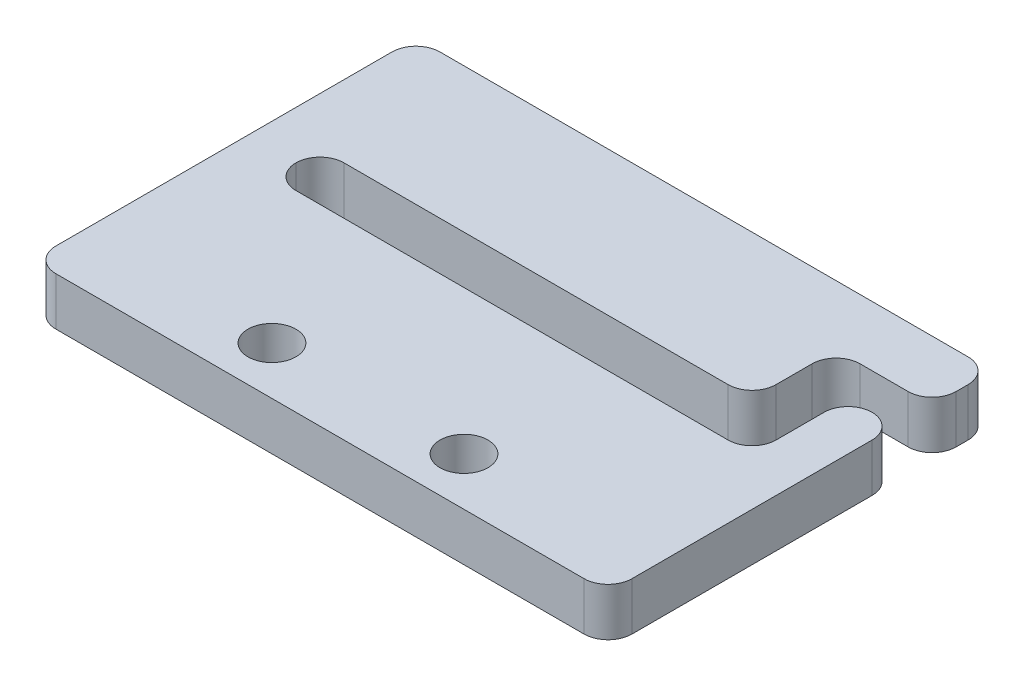
ISO-10303-21;
HEADER;
FILE_DESCRIPTION(('STEP AP214'),'2;1');
FILE_NAME('part.step','',(''),(''),'','','');
FILE_SCHEMA(('AUTOMOTIVE_DESIGN { 1 0 10303 214 1 1 1 1 }'));
ENDSEC;
DATA;
#1=APPLICATION_CONTEXT('core data for automotive mechanical design processes');
#2=APPLICATION_PROTOCOL_DEFINITION('international standard','automotive_design',2000,#1);
#3=PRODUCT_CONTEXT('',#1,'mechanical');
#4=PRODUCT('Part','Part','',(#3));
#5=PRODUCT_RELATED_PRODUCT_CATEGORY('part','',(#4));
#6=PRODUCT_DEFINITION_FORMATION('','',#4);
#7=PRODUCT_DEFINITION_CONTEXT('part definition',#1,'design');
#8=PRODUCT_DEFINITION('design','',#6,#7);
#9=PRODUCT_DEFINITION_SHAPE('','',#8);
#10=(LENGTH_UNIT() NAMED_UNIT(*) SI_UNIT(.MILLI.,.METRE.));
#11=(NAMED_UNIT(*) PLANE_ANGLE_UNIT() SI_UNIT($,.RADIAN.));
#12=(NAMED_UNIT(*) SI_UNIT($,.STERADIAN.) SOLID_ANGLE_UNIT());
#13=UNCERTAINTY_MEASURE_WITH_UNIT(LENGTH_MEASURE(1.E-05),#10,'distance_accuracy_value','');
#14=(GEOMETRIC_REPRESENTATION_CONTEXT(3) GLOBAL_UNCERTAINTY_ASSIGNED_CONTEXT((#13)) GLOBAL_UNIT_ASSIGNED_CONTEXT((#10,
#11,#12)) REPRESENTATION_CONTEXT('',''));
#15=CARTESIAN_POINT('',(0.,0.,0.));
#16=DIRECTION('',(0.,0.,1.));
#17=DIRECTION('',(1.,0.,0.));
#18=AXIS2_PLACEMENT_3D('',#15,#16,#17);
#19=CARTESIAN_POINT('',(69.85,6.35,0.));
#20=DIRECTION('',(-1.,0.,0.));
#21=DIRECTION('',(0.,0.,1.));
#22=AXIS2_PLACEMENT_3D('',#19,#20,#21);
#23=PLANE('',#22);
#24=DIRECTION('',(0.,0.,-1.));
#25=VECTOR('',#24,1.);
#26=CARTESIAN_POINT('',(69.85,6.35,0.));
#27=LINE('',#26,#25);
#28=CARTESIAN_POINT('',(69.85,6.35,22.225));
#29=VERTEX_POINT('',#28);
#30=CARTESIAN_POINT('',(69.85,6.35,15.875));
#31=VERTEX_POINT('',#30);
#32=EDGE_CURVE('E320',#29,#31,#27,.T.);
#33=ORIENTED_EDGE('',*,*,#32,.T.);
#34=DIRECTION('',(0.,-1.,0.));
#35=VECTOR('',#34,1.);
#36=CARTESIAN_POINT('',(69.85,6.35,15.875));
#37=LINE('',#36,#35);
#38=CARTESIAN_POINT('',(69.85,0.,15.875));
#39=VERTEX_POINT('',#38);
#40=EDGE_CURVE('E308',#31,#39,#37,.T.);
#41=ORIENTED_EDGE('',*,*,#40,.T.);
#42=DIRECTION('',(0.,0.,-1.));
#43=VECTOR('',#42,1.);
#44=CARTESIAN_POINT('',(69.85,0.,0.));
#45=LINE('',#44,#43);
#46=CARTESIAN_POINT('',(69.85,0.,22.225));
#47=VERTEX_POINT('',#46);
#48=EDGE_CURVE('E312',#47,#39,#45,.T.);
#49=ORIENTED_EDGE('',*,*,#48,.F.);
#50=DIRECTION('',(0.,-1.,0.));
#51=VECTOR('',#50,1.);
#52=CARTESIAN_POINT('',(69.85,6.35,22.225));
#53=LINE('',#52,#51);
#54=EDGE_CURVE('E268',#47,#29,#53,.F.);
#55=ORIENTED_EDGE('',*,*,#54,.T.);
#56=EDGE_LOOP('',(#33,#41,#49,#55));
#57=FACE_BOUND('',#56,.T.);
#58=ADVANCED_FACE('F35',(#57),#23,.T.);
#59=CARTESIAN_POINT('',(0.,6.35,25.4));
#60=DIRECTION('',(0.,0.,-1.));
#61=DIRECTION('',(-1.,0.,0.));
#62=AXIS2_PLACEMENT_3D('',#59,#60,#61);
#63=PLANE('',#62);
#64=DIRECTION('',(1.,0.,0.));
#65=VECTOR('',#64,1.);
#66=CARTESIAN_POINT('',(0.,6.35,25.4));
#67=LINE('',#66,#65);
#68=CARTESIAN_POINT('',(9.525,6.35,25.4));
#69=VERTEX_POINT('',#68);
#70=CARTESIAN_POINT('',(66.675,6.35,25.4));
#71=VERTEX_POINT('',#70);
#72=EDGE_CURVE('E322',#69,#71,#67,.T.);
#73=ORIENTED_EDGE('',*,*,#72,.T.);
#74=DIRECTION('',(0.,-1.,0.));
#75=VECTOR('',#74,1.);
#76=CARTESIAN_POINT('',(66.675,0.,25.4));
#77=LINE('',#76,#75);
#78=CARTESIAN_POINT('',(66.675,0.,25.4));
#79=VERTEX_POINT('',#78);
#80=EDGE_CURVE('E265',#71,#79,#77,.T.);
#81=ORIENTED_EDGE('',*,*,#80,.T.);
#82=DIRECTION('',(1.,0.,0.));
#83=VECTOR('',#82,1.);
#84=CARTESIAN_POINT('',(0.,0.,25.4));
#85=LINE('',#84,#83);
#86=CARTESIAN_POINT('',(9.525,0.,25.4));
#87=VERTEX_POINT('',#86);
#88=EDGE_CURVE('E194',#87,#79,#85,.T.);
#89=ORIENTED_EDGE('',*,*,#88,.F.);
#90=DIRECTION('',(0.,-1.,0.));
#91=VECTOR('',#90,1.);
#92=CARTESIAN_POINT('',(9.525,6.35,25.4));
#93=LINE('',#92,#91);
#94=EDGE_CURVE('E205',#87,#69,#93,.F.);
#95=ORIENTED_EDGE('',*,*,#94,.T.);
#96=EDGE_LOOP('',(#73,#81,#89,#95));
#97=FACE_BOUND('',#96,.T.);
#98=ADVANCED_FACE('F449',(#97),#63,.T.);
#99=CARTESIAN_POINT('',(0.,6.35,19.05));
#100=DIRECTION('',(0.,0.,1.));
#101=DIRECTION('',(1.,0.,0.));
#102=AXIS2_PLACEMENT_3D('',#99,#100,#101);
#103=PLANE('',#102);
#104=DIRECTION('',(-1.,0.,0.));
#105=VECTOR('',#104,1.);
#106=CARTESIAN_POINT('',(0.,0.,19.05));
#107=LINE('',#106,#105);
#108=CARTESIAN_POINT('',(60.325,0.,19.05));
#109=VERTEX_POINT('',#108);
#110=CARTESIAN_POINT('',(9.525,0.,19.05));
#111=VERTEX_POINT('',#110);
#112=EDGE_CURVE('E182',#109,#111,#107,.T.);
#113=ORIENTED_EDGE('',*,*,#112,.F.);
#114=DIRECTION('',(0.,-1.,0.));
#115=VECTOR('',#114,1.);
#116=CARTESIAN_POINT('',(60.325,6.35,19.05));
#117=LINE('',#116,#115);
#118=CARTESIAN_POINT('',(60.325,6.35,19.05));
#119=VERTEX_POINT('',#118);
#120=EDGE_CURVE('E285',#109,#119,#117,.F.);
#121=ORIENTED_EDGE('',*,*,#120,.T.);
#122=DIRECTION('',(-1.,0.,0.));
#123=VECTOR('',#122,1.);
#124=CARTESIAN_POINT('',(0.,6.35,19.05));
#125=LINE('',#124,#123);
#126=CARTESIAN_POINT('',(9.525,6.35,19.05));
#127=VERTEX_POINT('',#126);
#128=EDGE_CURVE('E209',#119,#127,#125,.T.);
#129=ORIENTED_EDGE('',*,*,#128,.T.);
#130=DIRECTION('',(0.,-1.,0.));
#131=VECTOR('',#130,1.);
#132=CARTESIAN_POINT('',(9.525,0.,19.05));
#133=LINE('',#132,#131);
#134=EDGE_CURVE('E201',#127,#111,#133,.T.);
#135=ORIENTED_EDGE('',*,*,#134,.T.);
#136=EDGE_LOOP('',(#113,#121,#129,#135));
#137=FACE_BOUND('',#136,.T.);
#138=ADVANCED_FACE('F207',(#137),#103,.T.);
#139=CARTESIAN_POINT('',(63.5,6.35,0.));
#140=DIRECTION('',(1.,0.,0.));
#141=DIRECTION('',(0.,0.,-1.));
#142=AXIS2_PLACEMENT_3D('',#139,#140,#141);
#143=PLANE('',#142);
#144=DIRECTION('',(0.,0.,1.));
#145=VECTOR('',#144,1.);
#146=CARTESIAN_POINT('',(63.5,0.,0.));
#147=LINE('',#146,#145);
#148=CARTESIAN_POINT('',(63.5,0.,11.1125));
#149=VERTEX_POINT('',#148);
#150=CARTESIAN_POINT('',(63.5,0.,15.875));
#151=VERTEX_POINT('',#150);
#152=EDGE_CURVE('E193',#149,#151,#147,.T.);
#153=ORIENTED_EDGE('',*,*,#152,.F.);
#154=DIRECTION('',(0.,-1.,0.));
#155=VECTOR('',#154,1.);
#156=CARTESIAN_POINT('',(63.5,6.35,11.1125));
#157=LINE('',#156,#155);
#158=CARTESIAN_POINT('',(63.5,6.35,11.1125));
#159=VERTEX_POINT('',#158);
#160=EDGE_CURVE('E278',#149,#159,#157,.F.);
#161=ORIENTED_EDGE('',*,*,#160,.T.);
#162=DIRECTION('',(0.,0.,1.));
#163=VECTOR('',#162,1.);
#164=CARTESIAN_POINT('',(63.5,6.35,0.));
#165=LINE('',#164,#163);
#166=CARTESIAN_POINT('',(63.5,6.35,15.875));
#167=VERTEX_POINT('',#166);
#168=EDGE_CURVE('E333',#159,#167,#165,.T.);
#169=ORIENTED_EDGE('',*,*,#168,.T.);
#170=DIRECTION('',(0.,-1.,0.));
#171=VECTOR('',#170,1.);
#172=CARTESIAN_POINT('',(63.5,6.35,15.875));
#173=LINE('',#172,#171);
#174=EDGE_CURVE('E275',#167,#151,#173,.T.);
#175=ORIENTED_EDGE('',*,*,#174,.T.);
#176=EDGE_LOOP('',(#153,#161,#169,#175));
#177=FACE_BOUND('',#176,.T.);
#178=ADVANCED_FACE('F436',(#177),#143,.T.);
#179=CARTESIAN_POINT('',(0.,6.35,7.93750000000002));
#180=DIRECTION('',(0.,0.,1.));
#181=DIRECTION('',(1.,0.,0.));
#182=AXIS2_PLACEMENT_3D('',#179,#180,#181);
#183=PLANE('',#182);
#184=DIRECTION('',(-1.,0.,0.));
#185=VECTOR('',#184,1.);
#186=CARTESIAN_POINT('',(0.,6.35,7.93750000000002));
#187=LINE('',#186,#185);
#188=CARTESIAN_POINT('',(73.025,6.35,7.9375));
#189=VERTEX_POINT('',#188);
#190=CARTESIAN_POINT('',(66.675,6.35,7.9375));
#191=VERTEX_POINT('',#190);
#192=EDGE_CURVE('E336',#189,#191,#187,.T.);
#193=ORIENTED_EDGE('',*,*,#192,.T.);
#194=DIRECTION('',(0.,-1.,0.));
#195=VECTOR('',#194,1.);
#196=CARTESIAN_POINT('',(66.675,0.,7.9375));
#197=LINE('',#196,#195);
#198=CARTESIAN_POINT('',(66.675,0.,7.9375));
#199=VERTEX_POINT('',#198);
#200=EDGE_CURVE('E272',#191,#199,#197,.T.);
#201=ORIENTED_EDGE('',*,*,#200,.T.);
#202=DIRECTION('',(-1.,0.,0.));
#203=VECTOR('',#202,1.);
#204=CARTESIAN_POINT('',(0.,0.,7.93750000000002));
#205=LINE('',#204,#203);
#206=CARTESIAN_POINT('',(73.025,0.,7.9375));
#207=VERTEX_POINT('',#206);
#208=EDGE_CURVE('E357',#207,#199,#205,.T.);
#209=ORIENTED_EDGE('',*,*,#208,.F.);
#210=DIRECTION('',(0.,-1.,0.));
#211=VECTOR('',#210,1.);
#212=CARTESIAN_POINT('',(73.025,6.35,7.9375));
#213=LINE('',#212,#211);
#214=EDGE_CURVE('E270',#207,#189,#213,.F.);
#215=ORIENTED_EDGE('',*,*,#214,.T.);
#216=EDGE_LOOP('',(#193,#201,#209,#215));
#217=FACE_BOUND('',#216,.T.);
#218=ADVANCED_FACE('F427',(#217),#183,.T.);
#219=CARTESIAN_POINT('',(76.2,6.35,0.));
#220=DIRECTION('',(1.,0.,0.));
#221=DIRECTION('',(0.,0.,-1.));
#222=AXIS2_PLACEMENT_3D('',#219,#220,#221);
#223=PLANE('',#222);
#224=DIRECTION('',(0.,0.,1.));
#225=VECTOR('',#224,1.);
#226=CARTESIAN_POINT('',(76.2,6.35,0.));
#227=LINE('',#226,#225);
#228=CARTESIAN_POINT('',(76.2,6.35,3.175));
#229=VERTEX_POINT('',#228);
#230=CARTESIAN_POINT('',(76.2,6.35,4.7625));
#231=VERTEX_POINT('',#230);
#232=EDGE_CURVE('E216',#229,#231,#227,.T.);
#233=ORIENTED_EDGE('',*,*,#232,.T.);
#234=DIRECTION('',(0.,-1.,0.));
#235=VECTOR('',#234,1.);
#236=CARTESIAN_POINT('',(76.2,6.35,4.7625));
#237=LINE('',#236,#235);
#238=CARTESIAN_POINT('',(76.2,0.,4.7625));
#239=VERTEX_POINT('',#238);
#240=EDGE_CURVE('E293',#231,#239,#237,.T.);
#241=ORIENTED_EDGE('',*,*,#240,.T.);
#242=DIRECTION('',(0.,0.,1.));
#243=VECTOR('',#242,1.);
#244=CARTESIAN_POINT('',(76.2,0.,0.));
#245=LINE('',#244,#243);
#246=CARTESIAN_POINT('',(76.2,0.,3.175));
#247=VERTEX_POINT('',#246);
#248=EDGE_CURVE('E360',#247,#239,#245,.T.);
#249=ORIENTED_EDGE('',*,*,#248,.F.);
#250=DIRECTION('',(0.,-1.,0.));
#251=VECTOR('',#250,1.);
#252=CARTESIAN_POINT('',(76.2,6.35,3.175));
#253=LINE('',#252,#251);
#254=EDGE_CURVE('E263',#247,#229,#253,.F.);
#255=ORIENTED_EDGE('',*,*,#254,.T.);
#256=EDGE_LOOP('',(#233,#241,#249,#255));
#257=FACE_BOUND('',#256,.T.);
#258=ADVANCED_FACE('F418',(#257),#223,.T.);
#259=CARTESIAN_POINT('',(0.,6.35,0.));
#260=DIRECTION('',(0.,0.,-1.));
#261=DIRECTION('',(-1.,0.,0.));
#262=AXIS2_PLACEMENT_3D('',#259,#260,#261);
#263=PLANE('',#262);
#264=DIRECTION('',(1.,0.,0.));
#265=VECTOR('',#264,1.);
#266=CARTESIAN_POINT('',(0.,0.,0.));
#267=LINE('',#266,#265);
#268=CARTESIAN_POINT('',(3.175,0.,0.));
#269=VERTEX_POINT('',#268);
#270=CARTESIAN_POINT('',(73.025,0.,0.));
#271=VERTEX_POINT('',#270);
#272=EDGE_CURVE('E363',#269,#271,#267,.T.);
#273=ORIENTED_EDGE('',*,*,#272,.F.);
#274=DIRECTION('',(0.,-1.,0.));
#275=VECTOR('',#274,1.);
#276=CARTESIAN_POINT('',(3.175,6.35,0.));
#277=LINE('',#276,#275);
#278=CARTESIAN_POINT('',(3.175,6.35,0.));
#279=VERTEX_POINT('',#278);
#280=EDGE_CURVE('E261',#269,#279,#277,.F.);
#281=ORIENTED_EDGE('',*,*,#280,.T.);
#282=DIRECTION('',(1.,0.,0.));
#283=VECTOR('',#282,1.);
#284=CARTESIAN_POINT('',(0.,6.35,0.));
#285=LINE('',#284,#283);
#286=CARTESIAN_POINT('',(73.025,6.35,0.));
#287=VERTEX_POINT('',#286);
#288=EDGE_CURVE('E340',#279,#287,#285,.T.);
#289=ORIENTED_EDGE('',*,*,#288,.T.);
#290=DIRECTION('',(0.,-1.,0.));
#291=VECTOR('',#290,1.);
#292=CARTESIAN_POINT('',(73.025,6.35,0.));
#293=LINE('',#292,#291);
#294=EDGE_CURVE('E258',#287,#271,#293,.T.);
#295=ORIENTED_EDGE('',*,*,#294,.T.);
#296=EDGE_LOOP('',(#273,#281,#289,#295));
#297=FACE_BOUND('',#296,.T.);
#298=ADVANCED_FACE('F410',(#297),#263,.T.);
#299=CARTESIAN_POINT('',(0.,6.35,0.));
#300=DIRECTION('',(1.,0.,0.));
#301=DIRECTION('',(0.,0.,-1.));
#302=AXIS2_PLACEMENT_3D('',#299,#300,#301);
#303=PLANE('',#302);
#304=DIRECTION('',(0.,0.,1.));
#305=VECTOR('',#304,1.);
#306=CARTESIAN_POINT('',(0.,0.,0.));
#307=LINE('',#306,#305);
#308=CARTESIAN_POINT('',(0.,0.,3.175));
#309=VERTEX_POINT('',#308);
#310=CARTESIAN_POINT('',(0.,0.,47.625));
#311=VERTEX_POINT('',#310);
#312=EDGE_CURVE('E366',#309,#311,#307,.T.);
#313=ORIENTED_EDGE('',*,*,#312,.T.);
#314=DIRECTION('',(0.,-1.,0.));
#315=VECTOR('',#314,1.);
#316=CARTESIAN_POINT('',(0.,6.35,47.625));
#317=LINE('',#316,#315);
#318=CARTESIAN_POINT('',(0.,6.35,47.625));
#319=VERTEX_POINT('',#318);
#320=EDGE_CURVE('E256',#311,#319,#317,.F.);
#321=ORIENTED_EDGE('',*,*,#320,.T.);
#322=DIRECTION('',(0.,0.,1.));
#323=VECTOR('',#322,1.);
#324=CARTESIAN_POINT('',(0.,6.35,0.));
#325=LINE('',#324,#323);
#326=CARTESIAN_POINT('',(0.,6.35,3.175));
#327=VERTEX_POINT('',#326);
#328=EDGE_CURVE('E343',#327,#319,#325,.T.);
#329=ORIENTED_EDGE('',*,*,#328,.F.);
#330=DIRECTION('',(0.,-1.,0.));
#331=VECTOR('',#330,1.);
#332=CARTESIAN_POINT('',(0.,0.,3.175));
#333=LINE('',#332,#331);
#334=EDGE_CURVE('E253',#327,#309,#333,.T.);
#335=ORIENTED_EDGE('',*,*,#334,.T.);
#336=EDGE_LOOP('',(#313,#321,#329,#335));
#337=FACE_BOUND('',#336,.T.);
#338=ADVANCED_FACE('F404',(#337),#303,.F.);
#339=CARTESIAN_POINT('',(0.,6.35,50.8));
#340=DIRECTION('',(0.,0.,-1.));
#341=DIRECTION('',(-1.,0.,0.));
#342=AXIS2_PLACEMENT_3D('',#339,#340,#341);
#343=PLANE('',#342);
#344=DIRECTION('',(1.,0.,0.));
#345=VECTOR('',#344,1.);
#346=CARTESIAN_POINT('',(0.,0.,50.8));
#347=LINE('',#346,#345);
#348=CARTESIAN_POINT('',(3.17500000000001,0.,50.8));
#349=VERTEX_POINT('',#348);
#350=CARTESIAN_POINT('',(73.025,0.,50.8));
#351=VERTEX_POINT('',#350);
#352=EDGE_CURVE('E218',#349,#351,#347,.T.);
#353=ORIENTED_EDGE('',*,*,#352,.T.);
#354=DIRECTION('',(0.,-1.,0.));
#355=VECTOR('',#354,1.);
#356=CARTESIAN_POINT('',(73.025,6.35,50.8));
#357=LINE('',#356,#355);
#358=CARTESIAN_POINT('',(73.025,6.35,50.8));
#359=VERTEX_POINT('',#358);
#360=EDGE_CURVE('E242',#351,#359,#357,.F.);
#361=ORIENTED_EDGE('',*,*,#360,.T.);
#362=DIRECTION('',(1.,0.,0.));
#363=VECTOR('',#362,1.);
#364=CARTESIAN_POINT('',(0.,6.35,50.8));
#365=LINE('',#364,#363);
#366=CARTESIAN_POINT('',(3.17500000000001,6.35,50.8));
#367=VERTEX_POINT('',#366);
#368=EDGE_CURVE('E214',#367,#359,#365,.T.);
#369=ORIENTED_EDGE('',*,*,#368,.F.);
#370=DIRECTION('',(0.,-1.,0.));
#371=VECTOR('',#370,1.);
#372=CARTESIAN_POINT('',(3.17500000000001,6.35,50.8));
#373=LINE('',#372,#371);
#374=EDGE_CURVE('E239',#367,#349,#373,.T.);
#375=ORIENTED_EDGE('',*,*,#374,.T.);
#376=EDGE_LOOP('',(#353,#361,#369,#375));
#377=FACE_BOUND('',#376,.T.);
#378=ADVANCED_FACE('F399',(#377),#343,.F.);
#379=CARTESIAN_POINT('',(25.4,6.35,44.45));
#380=DIRECTION('',(0.,-1.,0.));
#381=DIRECTION('',(0.,0.,-1.));
#382=AXIS2_PLACEMENT_3D('',#379,#380,#381);
#383=CYLINDRICAL_SURFACE('',#382,3.175);
#384=CARTESIAN_POINT('',(25.4,6.35,44.45));
#385=DIRECTION('',(0.,1.,0.));
#386=DIRECTION('',(0.,0.,1.));
#387=AXIS2_PLACEMENT_3D('',#384,#385,#386);
#388=CIRCLE('',#387,3.175);
#389=CARTESIAN_POINT('',(25.4,6.35,47.625));
#390=VERTEX_POINT('',#389);
#391=EDGE_CURVE('E323',#390,#390,#388,.T.);
#392=ORIENTED_EDGE('',*,*,#391,.T.);
#393=EDGE_LOOP('',(#392));
#394=FACE_BOUND('',#393,.T.);
#395=CARTESIAN_POINT('',(25.4,0.,44.45));
#396=DIRECTION('',(0.,1.,0.));
#397=DIRECTION('',(0.,0.,1.));
#398=AXIS2_PLACEMENT_3D('',#395,#396,#397);
#399=CIRCLE('',#398,3.175);
#400=CARTESIAN_POINT('',(25.4,0.,47.625));
#401=VERTEX_POINT('',#400);
#402=EDGE_CURVE('E350',#401,#401,#399,.T.);
#403=ORIENTED_EDGE('',*,*,#402,.F.);
#404=EDGE_LOOP('',(#403));
#405=FACE_BOUND('',#404,.T.);
#406=ADVANCED_FACE('F469',(#394,#405),#383,.F.);
#407=CARTESIAN_POINT('',(50.8,6.35,44.45));
#408=DIRECTION('',(0.,-1.,0.));
#409=DIRECTION('',(0.,0.,-1.));
#410=AXIS2_PLACEMENT_3D('',#407,#408,#409);
#411=CYLINDRICAL_SURFACE('',#410,3.175);
#412=CARTESIAN_POINT('',(50.8,6.35,44.45));
#413=DIRECTION('',(0.,1.,0.));
#414=DIRECTION('',(0.,0.,1.));
#415=AXIS2_PLACEMENT_3D('',#412,#413,#414);
#416=CIRCLE('',#415,3.175);
#417=CARTESIAN_POINT('',(50.8,6.35,47.625));
#418=VERTEX_POINT('',#417);
#419=EDGE_CURVE('E328',#418,#418,#416,.T.);
#420=ORIENTED_EDGE('',*,*,#419,.T.);
#421=EDGE_LOOP('',(#420));
#422=FACE_BOUND('',#421,.T.);
#423=CARTESIAN_POINT('',(50.8,0.,44.45));
#424=DIRECTION('',(0.,1.,0.));
#425=DIRECTION('',(0.,0.,1.));
#426=AXIS2_PLACEMENT_3D('',#423,#424,#425);
#427=CIRCLE('',#426,3.175);
#428=CARTESIAN_POINT('',(50.8,0.,47.625));
#429=VERTEX_POINT('',#428);
#430=EDGE_CURVE('E228',#429,#429,#427,.T.);
#431=ORIENTED_EDGE('',*,*,#430,.F.);
#432=EDGE_LOOP('',(#431));
#433=FACE_BOUND('',#432,.T.);
#434=ADVANCED_FACE('F379',(#422,#433),#411,.F.);
#435=CARTESIAN_POINT('',(76.2,0.,15.875));
#436=VERTEX_POINT('',#435);
#437=CARTESIAN_POINT('',(76.2,0.,47.625));
#438=VERTEX_POINT('',#437);
#439=EDGE_CURVE('E364',#436,#438,#245,.T.);
#440=ORIENTED_EDGE('',*,*,#439,.F.);
#441=DIRECTION('',(0.,-1.,0.));
#442=VECTOR('',#441,1.);
#443=CARTESIAN_POINT('',(76.2,6.35,15.875));
#444=LINE('',#443,#442);
#445=CARTESIAN_POINT('',(76.2,6.35,15.875));
#446=VERTEX_POINT('',#445);
#447=EDGE_CURVE('E298',#436,#446,#444,.F.);
#448=ORIENTED_EDGE('',*,*,#447,.T.);
#449=CARTESIAN_POINT('',(76.2,6.35,47.625));
#450=VERTEX_POINT('',#449);
#451=EDGE_CURVE('E211',#446,#450,#227,.T.);
#452=ORIENTED_EDGE('',*,*,#451,.T.);
#453=DIRECTION('',(0.,-1.,0.));
#454=VECTOR('',#453,1.);
#455=CARTESIAN_POINT('',(76.2,0.,47.625));
#456=LINE('',#455,#454);
#457=EDGE_CURVE('E226',#450,#438,#456,.T.);
#458=ORIENTED_EDGE('',*,*,#457,.T.);
#459=EDGE_LOOP('',(#440,#448,#452,#458));
#460=FACE_BOUND('',#459,.T.);
#461=ADVANCED_FACE('F385',(#460),#223,.T.);
#462=CARTESIAN_POINT('',(0.,6.35,0.));
#463=DIRECTION('',(0.,1.,0.));
#464=DIRECTION('',(0.,0.,1.));
#465=AXIS2_PLACEMENT_3D('',#462,#463,#464);
#466=PLANE('',#465);
#467=ORIENTED_EDGE('',*,*,#419,.F.);
#468=EDGE_LOOP('',(#467));
#469=FACE_BOUND('',#468,.T.);
#470=ORIENTED_EDGE('',*,*,#391,.F.);
#471=EDGE_LOOP('',(#470));
#472=FACE_BOUND('',#471,.T.);
#473=CARTESIAN_POINT('',(73.025,6.35,15.875));
#474=DIRECTION('',(0.,1.,0.));
#475=DIRECTION('',(0.,0.,1.));
#476=AXIS2_PLACEMENT_3D('',#473,#474,#475);
#477=CIRCLE('',#476,3.175);
#478=CARTESIAN_POINT('',(73.025,6.35,12.7));
#479=VERTEX_POINT('',#478);
#480=EDGE_CURVE('E287',#446,#479,#477,.T.);
#481=ORIENTED_EDGE('',*,*,#480,.T.);
#482=CARTESIAN_POINT('',(73.025,6.35,15.875));
#483=DIRECTION('',(0.,1.,0.));
#484=DIRECTION('',(0.,0.,1.));
#485=AXIS2_PLACEMENT_3D('',#482,#483,#484);
#486=CIRCLE('',#485,3.175);
#487=EDGE_CURVE('E11',#479,#31,#486,.T.);
#488=ORIENTED_EDGE('',*,*,#487,.T.);
#489=ORIENTED_EDGE('',*,*,#32,.F.);
#490=CARTESIAN_POINT('',(66.675,6.35,22.225));
#491=DIRECTION('',(0.,1.,0.));
#492=DIRECTION('',(0.,0.,1.));
#493=AXIS2_PLACEMENT_3D('',#490,#491,#492);
#494=CIRCLE('',#493,3.175);
#495=EDGE_CURVE('E302',#29,#71,#494,.F.);
#496=ORIENTED_EDGE('',*,*,#495,.T.);
#497=ORIENTED_EDGE('',*,*,#72,.F.);
#498=CARTESIAN_POINT('',(9.525,6.35,22.225));
#499=DIRECTION('',(0.,1.,0.));
#500=DIRECTION('',(0.,0.,1.));
#501=AXIS2_PLACEMENT_3D('',#498,#499,#500);
#502=CIRCLE('',#501,3.175);
#503=CARTESIAN_POINT('',(6.35,6.35,22.225));
#504=VERTEX_POINT('',#503);
#505=EDGE_CURVE('E224',#69,#504,#502,.F.);
#506=ORIENTED_EDGE('',*,*,#505,.T.);
#507=CARTESIAN_POINT('',(9.525,6.35,22.225));
#508=DIRECTION('',(0.,1.,0.));
#509=DIRECTION('',(0.,0.,1.));
#510=AXIS2_PLACEMENT_3D('',#507,#508,#509);
#511=CIRCLE('',#510,3.175);
#512=EDGE_CURVE('E204',#504,#127,#511,.F.);
#513=ORIENTED_EDGE('',*,*,#512,.T.);
#514=ORIENTED_EDGE('',*,*,#128,.F.);
#515=CARTESIAN_POINT('',(60.325,6.35,15.875));
#516=DIRECTION('',(0.,1.,0.));
#517=DIRECTION('',(0.,0.,1.));
#518=AXIS2_PLACEMENT_3D('',#515,#516,#517);
#519=CIRCLE('',#518,3.175);
#520=EDGE_CURVE('E291',#119,#167,#519,.T.);
#521=ORIENTED_EDGE('',*,*,#520,.T.);
#522=ORIENTED_EDGE('',*,*,#168,.F.);
#523=CARTESIAN_POINT('',(66.675,6.35,11.1125));
#524=DIRECTION('',(0.,1.,0.));
#525=DIRECTION('',(0.,0.,1.));
#526=AXIS2_PLACEMENT_3D('',#523,#524,#525);
#527=CIRCLE('',#526,3.175);
#528=EDGE_CURVE('E306',#159,#191,#527,.F.);
#529=ORIENTED_EDGE('',*,*,#528,.T.);
#530=ORIENTED_EDGE('',*,*,#192,.F.);
#531=CARTESIAN_POINT('',(73.025,6.35,4.7625));
#532=DIRECTION('',(0.,1.,0.));
#533=DIRECTION('',(0.,0.,1.));
#534=AXIS2_PLACEMENT_3D('',#531,#532,#533);
#535=CIRCLE('',#534,3.175);
#536=EDGE_CURVE('E289',#189,#231,#535,.T.);
#537=ORIENTED_EDGE('',*,*,#536,.T.);
#538=ORIENTED_EDGE('',*,*,#232,.F.);
#539=CARTESIAN_POINT('',(73.025,6.35,3.175));
#540=DIRECTION('',(0.,1.,0.));
#541=DIRECTION('',(0.,0.,1.));
#542=AXIS2_PLACEMENT_3D('',#539,#540,#541);
#543=CIRCLE('',#542,3.175);
#544=EDGE_CURVE('E244',#229,#287,#543,.T.);
#545=ORIENTED_EDGE('',*,*,#544,.T.);
#546=ORIENTED_EDGE('',*,*,#288,.F.);
#547=CARTESIAN_POINT('',(3.175,6.35,3.175));
#548=DIRECTION('',(0.,1.,0.));
#549=DIRECTION('',(0.,0.,1.));
#550=AXIS2_PLACEMENT_3D('',#547,#548,#549);
#551=CIRCLE('',#550,3.175);
#552=EDGE_CURVE('E246',#279,#327,#551,.T.);
#553=ORIENTED_EDGE('',*,*,#552,.T.);
#554=ORIENTED_EDGE('',*,*,#328,.T.);
#555=CARTESIAN_POINT('',(3.17500000000001,6.35,47.625));
#556=DIRECTION('',(0.,1.,0.));
#557=DIRECTION('',(0.,0.,1.));
#558=AXIS2_PLACEMENT_3D('',#555,#556,#557);
#559=CIRCLE('',#558,3.175);
#560=EDGE_CURVE('E248',#319,#367,#559,.T.);
#561=ORIENTED_EDGE('',*,*,#560,.T.);
#562=ORIENTED_EDGE('',*,*,#368,.T.);
#563=CARTESIAN_POINT('',(73.025,6.35,47.625));
#564=DIRECTION('',(0.,1.,0.));
#565=DIRECTION('',(0.,0.,1.));
#566=AXIS2_PLACEMENT_3D('',#563,#564,#565);
#567=CIRCLE('',#566,3.175);
#568=EDGE_CURVE('E250',#359,#450,#567,.T.);
#569=ORIENTED_EDGE('',*,*,#568,.T.);
#570=ORIENTED_EDGE('',*,*,#451,.F.);
#571=EDGE_LOOP('',(#481,#488,#489,#496,#497,#506,#513,#514,#521,#522,#529,#530,#537,#538,#545,
#546,#553,#554,#561,#562,#569,#570));
#572=FACE_BOUND('',#571,.T.);
#573=ADVANCED_FACE('F382',(#469,#472,#572),#466,.T.);
#574=CARTESIAN_POINT('',(0.,0.,0.));
#575=DIRECTION('',(0.,1.,0.));
#576=DIRECTION('',(0.,0.,1.));
#577=AXIS2_PLACEMENT_3D('',#574,#575,#576);
#578=PLANE('',#577);
#579=ORIENTED_EDGE('',*,*,#430,.T.);
#580=EDGE_LOOP('',(#579));
#581=FACE_BOUND('',#580,.T.);
#582=ORIENTED_EDGE('',*,*,#402,.T.);
#583=EDGE_LOOP('',(#582));
#584=FACE_BOUND('',#583,.T.);
#585=ORIENTED_EDGE('',*,*,#48,.T.);
#586=CARTESIAN_POINT('',(73.025,0.,15.875));
#587=DIRECTION('',(0.,1.,0.));
#588=DIRECTION('',(0.,0.,1.));
#589=AXIS2_PLACEMENT_3D('',#586,#587,#588);
#590=CIRCLE('',#589,3.175);
#591=CARTESIAN_POINT('',(73.025,0.,12.7));
#592=VERTEX_POINT('',#591);
#593=EDGE_CURVE('E43',#39,#592,#590,.F.);
#594=ORIENTED_EDGE('',*,*,#593,.T.);
#595=CARTESIAN_POINT('',(73.025,0.,15.875));
#596=DIRECTION('',(0.,1.,0.));
#597=DIRECTION('',(0.,0.,1.));
#598=AXIS2_PLACEMENT_3D('',#595,#596,#597);
#599=CIRCLE('',#598,3.175);
#600=EDGE_CURVE('E280',#592,#436,#599,.F.);
#601=ORIENTED_EDGE('',*,*,#600,.T.);
#602=ORIENTED_EDGE('',*,*,#439,.T.);
#603=CARTESIAN_POINT('',(73.025,0.,47.625));
#604=DIRECTION('',(0.,1.,0.));
#605=DIRECTION('',(0.,0.,1.));
#606=AXIS2_PLACEMENT_3D('',#603,#604,#605);
#607=CIRCLE('',#606,3.175);
#608=EDGE_CURVE('E237',#438,#351,#607,.F.);
#609=ORIENTED_EDGE('',*,*,#608,.T.);
#610=ORIENTED_EDGE('',*,*,#352,.F.);
#611=CARTESIAN_POINT('',(3.17500000000001,0.,47.625));
#612=DIRECTION('',(0.,1.,0.));
#613=DIRECTION('',(0.,0.,1.));
#614=AXIS2_PLACEMENT_3D('',#611,#612,#613);
#615=CIRCLE('',#614,3.175);
#616=EDGE_CURVE('E235',#349,#311,#615,.F.);
#617=ORIENTED_EDGE('',*,*,#616,.T.);
#618=ORIENTED_EDGE('',*,*,#312,.F.);
#619=CARTESIAN_POINT('',(3.175,0.,3.175));
#620=DIRECTION('',(0.,1.,0.));
#621=DIRECTION('',(0.,0.,1.));
#622=AXIS2_PLACEMENT_3D('',#619,#620,#621);
#623=CIRCLE('',#622,3.175);
#624=EDGE_CURVE('E233',#309,#269,#623,.F.);
#625=ORIENTED_EDGE('',*,*,#624,.T.);
#626=ORIENTED_EDGE('',*,*,#272,.T.);
#627=CARTESIAN_POINT('',(73.025,0.,3.175));
#628=DIRECTION('',(0.,1.,0.));
#629=DIRECTION('',(0.,0.,1.));
#630=AXIS2_PLACEMENT_3D('',#627,#628,#629);
#631=CIRCLE('',#630,3.175);
#632=EDGE_CURVE('E231',#271,#247,#631,.F.);
#633=ORIENTED_EDGE('',*,*,#632,.T.);
#634=ORIENTED_EDGE('',*,*,#248,.T.);
#635=CARTESIAN_POINT('',(73.025,0.,4.7625));
#636=DIRECTION('',(0.,1.,0.));
#637=DIRECTION('',(0.,0.,1.));
#638=AXIS2_PLACEMENT_3D('',#635,#636,#637);
#639=CIRCLE('',#638,3.175);
#640=EDGE_CURVE('E282',#239,#207,#639,.F.);
#641=ORIENTED_EDGE('',*,*,#640,.T.);
#642=ORIENTED_EDGE('',*,*,#208,.T.);
#643=CARTESIAN_POINT('',(66.675,0.,11.1125));
#644=DIRECTION('',(0.,1.,0.));
#645=DIRECTION('',(0.,0.,1.));
#646=AXIS2_PLACEMENT_3D('',#643,#644,#645);
#647=CIRCLE('',#646,3.175);
#648=EDGE_CURVE('E304',#199,#149,#647,.T.);
#649=ORIENTED_EDGE('',*,*,#648,.T.);
#650=ORIENTED_EDGE('',*,*,#152,.T.);
#651=CARTESIAN_POINT('',(60.325,0.,15.875));
#652=DIRECTION('',(0.,1.,0.));
#653=DIRECTION('',(0.,0.,1.));
#654=AXIS2_PLACEMENT_3D('',#651,#652,#653);
#655=CIRCLE('',#654,3.175);
#656=EDGE_CURVE('E189',#151,#109,#655,.F.);
#657=ORIENTED_EDGE('',*,*,#656,.T.);
#658=ORIENTED_EDGE('',*,*,#112,.T.);
#659=CARTESIAN_POINT('',(9.525,0.,22.225));
#660=DIRECTION('',(0.,1.,0.));
#661=DIRECTION('',(0.,0.,1.));
#662=AXIS2_PLACEMENT_3D('',#659,#660,#661);
#663=CIRCLE('',#662,3.175);
#664=CARTESIAN_POINT('',(6.35,0.,22.225));
#665=VERTEX_POINT('',#664);
#666=EDGE_CURVE('E186',#111,#665,#663,.T.);
#667=ORIENTED_EDGE('',*,*,#666,.T.);
#668=CARTESIAN_POINT('',(9.525,0.,22.225));
#669=DIRECTION('',(0.,1.,0.));
#670=DIRECTION('',(0.,0.,1.));
#671=AXIS2_PLACEMENT_3D('',#668,#669,#670);
#672=CIRCLE('',#671,3.175);
#673=EDGE_CURVE('E222',#665,#87,#672,.T.);
#674=ORIENTED_EDGE('',*,*,#673,.T.);
#675=ORIENTED_EDGE('',*,*,#88,.T.);
#676=CARTESIAN_POINT('',(66.675,0.,22.225));
#677=DIRECTION('',(0.,1.,0.));
#678=DIRECTION('',(0.,0.,1.));
#679=AXIS2_PLACEMENT_3D('',#676,#677,#678);
#680=CIRCLE('',#679,3.175);
#681=EDGE_CURVE('E300',#79,#47,#680,.T.);
#682=ORIENTED_EDGE('',*,*,#681,.T.);
#683=EDGE_LOOP('',(#585,#594,#601,#602,#609,#610,#617,#618,#625,#626,#633,#634,#641,#642,#649,
#650,#657,#658,#667,#674,#675,#682));
#684=FACE_BOUND('',#683,.T.);
#685=ADVANCED_FACE('F185',(#581,#584,#684),#578,.F.);
#686=CARTESIAN_POINT('',(9.525,6.35,22.225));
#687=DIRECTION('',(0.,1.,0.));
#688=DIRECTION('',(0.,0.,1.));
#689=AXIS2_PLACEMENT_3D('',#686,#687,#688);
#690=CYLINDRICAL_SURFACE('',#689,3.175);
#691=DIRECTION('',(0.,-1.,0.));
#692=VECTOR('',#691,1.);
#693=CARTESIAN_POINT('',(6.35,0.,22.225));
#694=LINE('',#693,#692);
#695=EDGE_CURVE('E203',#504,#665,#694,.T.);
#696=ORIENTED_EDGE('',*,*,#695,.F.);
#697=ORIENTED_EDGE('',*,*,#505,.F.);
#698=ORIENTED_EDGE('',*,*,#94,.F.);
#699=ORIENTED_EDGE('',*,*,#673,.F.);
#700=EDGE_LOOP('',(#696,#697,#698,#699));
#701=FACE_BOUND('',#700,.T.);
#702=ADVANCED_FACE('F446',(#701),#690,.F.);
#703=CARTESIAN_POINT('',(9.525,6.35,22.225));
#704=DIRECTION('',(0.,1.,0.));
#705=DIRECTION('',(0.,0.,1.));
#706=AXIS2_PLACEMENT_3D('',#703,#704,#705);
#707=CYLINDRICAL_SURFACE('',#706,3.175);
#708=ORIENTED_EDGE('',*,*,#512,.F.);
#709=ORIENTED_EDGE('',*,*,#695,.T.);
#710=ORIENTED_EDGE('',*,*,#666,.F.);
#711=ORIENTED_EDGE('',*,*,#134,.F.);
#712=EDGE_LOOP('',(#708,#709,#710,#711));
#713=FACE_BOUND('',#712,.T.);
#714=ADVANCED_FACE('F200',(#713),#707,.F.);
#715=CARTESIAN_POINT('',(73.025,6.35,47.625));
#716=DIRECTION('',(0.,1.,0.));
#717=DIRECTION('',(0.,0.,1.));
#718=AXIS2_PLACEMENT_3D('',#715,#716,#717);
#719=CYLINDRICAL_SURFACE('',#718,3.175);
#720=ORIENTED_EDGE('',*,*,#568,.F.);
#721=ORIENTED_EDGE('',*,*,#360,.F.);
#722=ORIENTED_EDGE('',*,*,#608,.F.);
#723=ORIENTED_EDGE('',*,*,#457,.F.);
#724=EDGE_LOOP('',(#720,#721,#722,#723));
#725=FACE_BOUND('',#724,.T.);
#726=ADVANCED_FACE('F393',(#725),#719,.T.);
#727=CARTESIAN_POINT('',(3.17500000000001,6.35,47.625));
#728=DIRECTION('',(0.,-1.,0.));
#729=DIRECTION('',(0.,0.,-1.));
#730=AXIS2_PLACEMENT_3D('',#727,#728,#729);
#731=CYLINDRICAL_SURFACE('',#730,3.175);
#732=ORIENTED_EDGE('',*,*,#560,.F.);
#733=ORIENTED_EDGE('',*,*,#320,.F.);
#734=ORIENTED_EDGE('',*,*,#616,.F.);
#735=ORIENTED_EDGE('',*,*,#374,.F.);
#736=EDGE_LOOP('',(#732,#733,#734,#735));
#737=FACE_BOUND('',#736,.T.);
#738=ADVANCED_FACE('F397',(#737),#731,.T.);
#739=CARTESIAN_POINT('',(3.175,6.35,3.175));
#740=DIRECTION('',(0.,1.,0.));
#741=DIRECTION('',(0.,0.,1.));
#742=AXIS2_PLACEMENT_3D('',#739,#740,#741);
#743=CYLINDRICAL_SURFACE('',#742,3.175);
#744=ORIENTED_EDGE('',*,*,#552,.F.);
#745=ORIENTED_EDGE('',*,*,#280,.F.);
#746=ORIENTED_EDGE('',*,*,#624,.F.);
#747=ORIENTED_EDGE('',*,*,#334,.F.);
#748=EDGE_LOOP('',(#744,#745,#746,#747));
#749=FACE_BOUND('',#748,.T.);
#750=ADVANCED_FACE('F406',(#749),#743,.T.);
#751=CARTESIAN_POINT('',(73.025,6.35,3.175));
#752=DIRECTION('',(0.,-1.,0.));
#753=DIRECTION('',(0.,0.,-1.));
#754=AXIS2_PLACEMENT_3D('',#751,#752,#753);
#755=CYLINDRICAL_SURFACE('',#754,3.175);
#756=ORIENTED_EDGE('',*,*,#544,.F.);
#757=ORIENTED_EDGE('',*,*,#254,.F.);
#758=ORIENTED_EDGE('',*,*,#632,.F.);
#759=ORIENTED_EDGE('',*,*,#294,.F.);
#760=EDGE_LOOP('',(#756,#757,#758,#759));
#761=FACE_BOUND('',#760,.T.);
#762=ADVANCED_FACE('F414',(#761),#755,.T.);
#763=CARTESIAN_POINT('',(66.675,6.35,22.225));
#764=DIRECTION('',(0.,1.,0.));
#765=DIRECTION('',(0.,0.,1.));
#766=AXIS2_PLACEMENT_3D('',#763,#764,#765);
#767=CYLINDRICAL_SURFACE('',#766,3.175);
#768=ORIENTED_EDGE('',*,*,#495,.F.);
#769=ORIENTED_EDGE('',*,*,#54,.F.);
#770=ORIENTED_EDGE('',*,*,#681,.F.);
#771=ORIENTED_EDGE('',*,*,#80,.F.);
#772=EDGE_LOOP('',(#768,#769,#770,#771));
#773=FACE_BOUND('',#772,.T.);
#774=ADVANCED_FACE('F452',(#773),#767,.F.);
#775=CARTESIAN_POINT('',(66.675,6.35,11.1125));
#776=DIRECTION('',(0.,1.,0.));
#777=DIRECTION('',(0.,0.,1.));
#778=AXIS2_PLACEMENT_3D('',#775,#776,#777);
#779=CYLINDRICAL_SURFACE('',#778,3.175);
#780=ORIENTED_EDGE('',*,*,#528,.F.);
#781=ORIENTED_EDGE('',*,*,#160,.F.);
#782=ORIENTED_EDGE('',*,*,#648,.F.);
#783=ORIENTED_EDGE('',*,*,#200,.F.);
#784=EDGE_LOOP('',(#780,#781,#782,#783));
#785=FACE_BOUND('',#784,.T.);
#786=ADVANCED_FACE('F432',(#785),#779,.F.);
#787=CARTESIAN_POINT('',(60.325,6.35,15.875));
#788=DIRECTION('',(0.,-1.,0.));
#789=DIRECTION('',(0.,0.,-1.));
#790=AXIS2_PLACEMENT_3D('',#787,#788,#789);
#791=CYLINDRICAL_SURFACE('',#790,3.175);
#792=ORIENTED_EDGE('',*,*,#520,.F.);
#793=ORIENTED_EDGE('',*,*,#120,.F.);
#794=ORIENTED_EDGE('',*,*,#656,.F.);
#795=ORIENTED_EDGE('',*,*,#174,.F.);
#796=EDGE_LOOP('',(#792,#793,#794,#795));
#797=FACE_BOUND('',#796,.T.);
#798=ADVANCED_FACE('F441',(#797),#791,.T.);
#799=CARTESIAN_POINT('',(73.025,6.35,4.7625));
#800=DIRECTION('',(0.,-1.,0.));
#801=DIRECTION('',(0.,0.,-1.));
#802=AXIS2_PLACEMENT_3D('',#799,#800,#801);
#803=CYLINDRICAL_SURFACE('',#802,3.175);
#804=ORIENTED_EDGE('',*,*,#536,.F.);
#805=ORIENTED_EDGE('',*,*,#214,.F.);
#806=ORIENTED_EDGE('',*,*,#640,.F.);
#807=ORIENTED_EDGE('',*,*,#240,.F.);
#808=EDGE_LOOP('',(#804,#805,#806,#807));
#809=FACE_BOUND('',#808,.T.);
#810=ADVANCED_FACE('F423',(#809),#803,.T.);
#811=CARTESIAN_POINT('',(73.025,6.35,15.875));
#812=DIRECTION('',(0.,-1.,0.));
#813=DIRECTION('',(0.,0.,-1.));
#814=AXIS2_PLACEMENT_3D('',#811,#812,#813);
#815=CYLINDRICAL_SURFACE('',#814,3.175);
#816=ORIENTED_EDGE('',*,*,#480,.F.);
#817=ORIENTED_EDGE('',*,*,#447,.F.);
#818=ORIENTED_EDGE('',*,*,#600,.F.);
#819=DIRECTION('',(0.,-1.,0.));
#820=VECTOR('',#819,1.);
#821=CARTESIAN_POINT('',(73.025,6.35,12.7));
#822=LINE('',#821,#820);
#823=EDGE_CURVE('E296',#479,#592,#822,.T.);
#824=ORIENTED_EDGE('',*,*,#823,.F.);
#825=EDGE_LOOP('',(#816,#817,#818,#824));
#826=FACE_BOUND('',#825,.T.);
#827=ADVANCED_FACE('F317',(#826),#815,.T.);
#828=CARTESIAN_POINT('',(73.025,6.35,15.875));
#829=DIRECTION('',(0.,-1.,0.));
#830=DIRECTION('',(0.,0.,-1.));
#831=AXIS2_PLACEMENT_3D('',#828,#829,#830);
#832=CYLINDRICAL_SURFACE('',#831,3.175);
#833=ORIENTED_EDGE('',*,*,#487,.F.);
#834=ORIENTED_EDGE('',*,*,#823,.T.);
#835=ORIENTED_EDGE('',*,*,#593,.F.);
#836=ORIENTED_EDGE('',*,*,#40,.F.);
#837=EDGE_LOOP('',(#833,#834,#835,#836));
#838=FACE_BOUND('',#837,.T.);
#839=ADVANCED_FACE('F37',(#838),#832,.T.);
#840=CLOSED_SHELL('',(#58,#98,#138,#178,#218,#258,#298,#338,#378,#406,#434,#461,#573,#685,#702,
#714,#726,#738,#750,#762,#774,#786,#798,#810,#827,#839));
#841=MANIFOLD_SOLID_BREP('B2',#840);
#842=ADVANCED_BREP_SHAPE_REPRESENTATION('',(#18,#841),#14);
#843=SHAPE_DEFINITION_REPRESENTATION(#9,#842);
ENDSEC;
END-ISO-10303-21;
